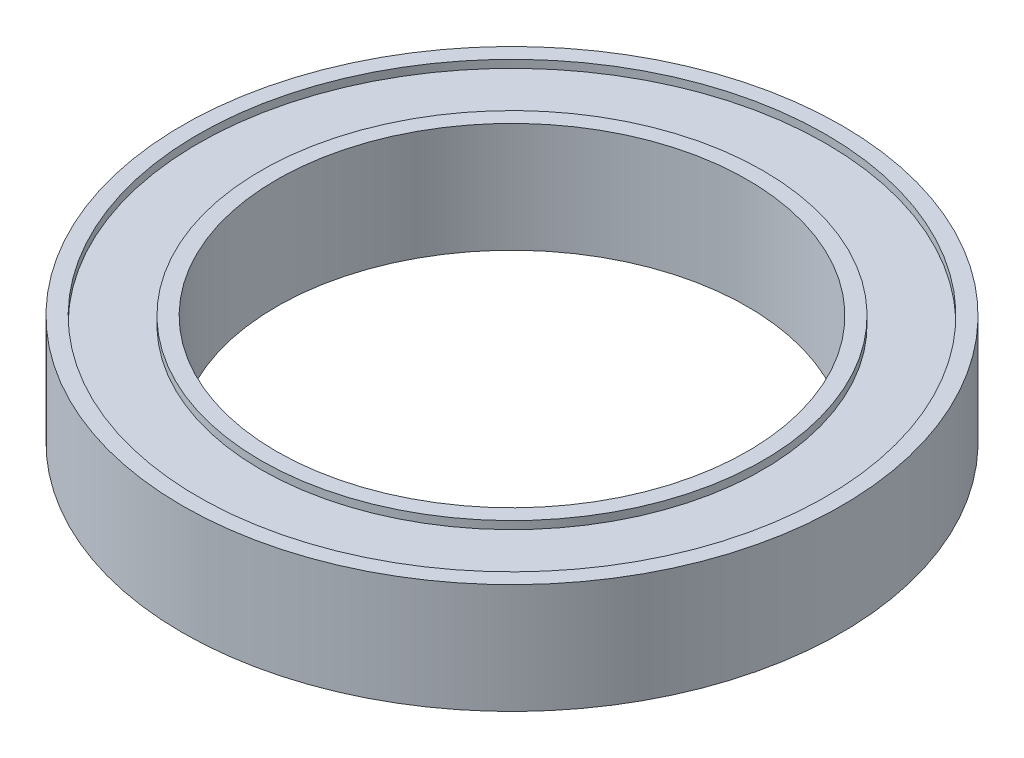
ISO-10303-21;
HEADER;
FILE_DESCRIPTION(('STEP AP214'),'2;1');
FILE_NAME('part.step','',(''),(''),'','','');
FILE_SCHEMA(('AUTOMOTIVE_DESIGN { 1 0 10303 214 1 1 1 1 }'));
ENDSEC;
DATA;
#1=APPLICATION_CONTEXT('core data for automotive mechanical design processes');
#2=APPLICATION_PROTOCOL_DEFINITION('international standard','automotive_design',2000,#1);
#3=PRODUCT_CONTEXT('',#1,'mechanical');
#4=PRODUCT('Part','Part','',(#3));
#5=PRODUCT_RELATED_PRODUCT_CATEGORY('part','',(#4));
#6=PRODUCT_DEFINITION_FORMATION('','',#4);
#7=PRODUCT_DEFINITION_CONTEXT('part definition',#1,'design');
#8=PRODUCT_DEFINITION('design','',#6,#7);
#9=PRODUCT_DEFINITION_SHAPE('','',#8);
#10=(LENGTH_UNIT() NAMED_UNIT(*) SI_UNIT(.MILLI.,.METRE.));
#11=(NAMED_UNIT(*) PLANE_ANGLE_UNIT() SI_UNIT($,.RADIAN.));
#12=(NAMED_UNIT(*) SI_UNIT($,.STERADIAN.) SOLID_ANGLE_UNIT());
#13=UNCERTAINTY_MEASURE_WITH_UNIT(LENGTH_MEASURE(1.E-05),#10,'distance_accuracy_value','');
#14=(GEOMETRIC_REPRESENTATION_CONTEXT(3) GLOBAL_UNCERTAINTY_ASSIGNED_CONTEXT((#13)) GLOBAL_UNIT_ASSIGNED_CONTEXT((#10,
#11,#12)) REPRESENTATION_CONTEXT('',''));
#15=CARTESIAN_POINT('',(0.,0.,0.));
#16=DIRECTION('',(0.,0.,1.));
#17=DIRECTION('',(1.,0.,0.));
#18=AXIS2_PLACEMENT_3D('',#15,#16,#17);
#19=CARTESIAN_POINT('',(0.,-3.5,0.));
#20=DIRECTION('',(0.,1.,0.));
#21=DIRECTION('',(0.,0.,1.));
#22=AXIS2_PLACEMENT_3D('',#19,#20,#21);
#23=PLANE('',#22);
#24=CARTESIAN_POINT('',(0.,-3.5,0.));
#25=DIRECTION('',(0.,1.,0.));
#26=DIRECTION('',(0.,0.,1.));
#27=AXIS2_PLACEMENT_3D('',#24,#25,#26);
#28=CIRCLE('',#27,15.);
#29=CARTESIAN_POINT('',(0.,-3.5,15.));
#30=VERTEX_POINT('',#29);
#31=EDGE_CURVE('E61',#30,#30,#28,.T.);
#32=ORIENTED_EDGE('',*,*,#31,.T.);
#33=EDGE_LOOP('',(#32));
#34=FACE_BOUND('',#33,.T.);
#35=CARTESIAN_POINT('',(0.,-3.5,0.));
#36=DIRECTION('',(0.,1.,0.));
#37=DIRECTION('',(0.,0.,1.));
#38=AXIS2_PLACEMENT_3D('',#35,#36,#37);
#39=CIRCLE('',#38,16.);
#40=CARTESIAN_POINT('',(0.,-3.5,16.));
#41=VERTEX_POINT('',#40);
#42=EDGE_CURVE('E70',#41,#41,#39,.T.);
#43=ORIENTED_EDGE('',*,*,#42,.F.);
#44=EDGE_LOOP('',(#43));
#45=FACE_BOUND('',#44,.T.);
#46=ADVANCED_FACE('F45',(#34,#45),#23,.F.);
#47=CARTESIAN_POINT('',(0.,3.5,0.));
#48=DIRECTION('',(0.,1.,0.));
#49=DIRECTION('',(0.,0.,1.));
#50=AXIS2_PLACEMENT_3D('',#47,#48,#49);
#51=PLANE('',#50);
#52=CARTESIAN_POINT('',(0.,3.5,0.));
#53=DIRECTION('',(0.,1.,0.));
#54=DIRECTION('',(0.,0.,1.));
#55=AXIS2_PLACEMENT_3D('',#52,#53,#54);
#56=CIRCLE('',#55,15.);
#57=CARTESIAN_POINT('',(0.,3.5,15.));
#58=VERTEX_POINT('',#57);
#59=EDGE_CURVE('E58',#58,#58,#56,.T.);
#60=ORIENTED_EDGE('',*,*,#59,.F.);
#61=EDGE_LOOP('',(#60));
#62=FACE_BOUND('',#61,.T.);
#63=CARTESIAN_POINT('',(0.,3.5,0.));
#64=DIRECTION('',(0.,1.,0.));
#65=DIRECTION('',(0.,0.,1.));
#66=AXIS2_PLACEMENT_3D('',#63,#64,#65);
#67=CIRCLE('',#66,16.);
#68=CARTESIAN_POINT('',(0.,3.5,-16.));
#69=VERTEX_POINT('',#68);
#70=EDGE_CURVE('E64',#69,#69,#67,.F.);
#71=ORIENTED_EDGE('',*,*,#70,.F.);
#72=EDGE_LOOP('',(#71));
#73=FACE_BOUND('',#72,.T.);
#74=ADVANCED_FACE('F112',(#62,#73),#51,.T.);
#75=CARTESIAN_POINT('',(0.,3.5,0.));
#76=DIRECTION('',(0.,1.,0.));
#77=DIRECTION('',(0.,0.,1.));
#78=AXIS2_PLACEMENT_3D('',#75,#76,#77);
#79=CIRCLE('',#78,20.);
#80=CARTESIAN_POINT('',(0.,3.5,-20.));
#81=VERTEX_POINT('',#80);
#82=EDGE_CURVE('E67',#81,#81,#79,.F.);
#83=ORIENTED_EDGE('',*,*,#82,.T.);
#84=EDGE_LOOP('',(#83));
#85=FACE_BOUND('',#84,.T.);
#86=CARTESIAN_POINT('',(0.,3.5,0.));
#87=DIRECTION('',(0.,1.,0.));
#88=DIRECTION('',(0.,0.,1.));
#89=AXIS2_PLACEMENT_3D('',#86,#87,#88);
#90=CIRCLE('',#89,21.);
#91=CARTESIAN_POINT('',(0.,3.5,21.));
#92=VERTEX_POINT('',#91);
#93=EDGE_CURVE('E10',#92,#92,#90,.T.);
#94=ORIENTED_EDGE('',*,*,#93,.T.);
#95=EDGE_LOOP('',(#94));
#96=FACE_BOUND('',#95,.T.);
#97=ADVANCED_FACE('F117',(#85,#96),#51,.T.);
#98=CARTESIAN_POINT('',(0.,-3.5,0.));
#99=DIRECTION('',(0.,1.,0.));
#100=DIRECTION('',(0.,0.,1.));
#101=AXIS2_PLACEMENT_3D('',#98,#99,#100);
#102=CIRCLE('',#101,20.);
#103=CARTESIAN_POINT('',(0.,-3.5,20.));
#104=VERTEX_POINT('',#103);
#105=EDGE_CURVE('E49',#104,#104,#102,.T.);
#106=ORIENTED_EDGE('',*,*,#105,.T.);
#107=EDGE_LOOP('',(#106));
#108=FACE_BOUND('',#107,.T.);
#109=CARTESIAN_POINT('',(0.,-3.5,0.));
#110=DIRECTION('',(0.,1.,0.));
#111=DIRECTION('',(0.,0.,1.));
#112=AXIS2_PLACEMENT_3D('',#109,#110,#111);
#113=CIRCLE('',#112,21.);
#114=CARTESIAN_POINT('',(0.,-3.5,21.));
#115=VERTEX_POINT('',#114);
#116=EDGE_CURVE('E53',#115,#115,#113,.T.);
#117=ORIENTED_EDGE('',*,*,#116,.F.);
#118=EDGE_LOOP('',(#117));
#119=FACE_BOUND('',#118,.T.);
#120=ADVANCED_FACE('F108',(#108,#119),#23,.F.);
#121=CARTESIAN_POINT('',(0.,3.5,0.));
#122=DIRECTION('',(0.,-1.,0.));
#123=DIRECTION('',(0.,0.,-1.));
#124=AXIS2_PLACEMENT_3D('',#121,#122,#123);
#125=CYLINDRICAL_SURFACE('',#124,21.);
#126=ORIENTED_EDGE('',*,*,#93,.F.);
#127=EDGE_LOOP('',(#126));
#128=FACE_BOUND('',#127,.T.);
#129=ORIENTED_EDGE('',*,*,#116,.T.);
#130=EDGE_LOOP('',(#129));
#131=FACE_BOUND('',#130,.T.);
#132=ADVANCED_FACE('F47',(#128,#131),#125,.T.);
#133=CARTESIAN_POINT('',(0.,3.5,0.));
#134=DIRECTION('',(0.,-1.,0.));
#135=DIRECTION('',(0.,0.,-1.));
#136=AXIS2_PLACEMENT_3D('',#133,#134,#135);
#137=CYLINDRICAL_SURFACE('',#136,15.);
#138=ORIENTED_EDGE('',*,*,#59,.T.);
#139=EDGE_LOOP('',(#138));
#140=FACE_BOUND('',#139,.T.);
#141=ORIENTED_EDGE('',*,*,#31,.F.);
#142=EDGE_LOOP('',(#141));
#143=FACE_BOUND('',#142,.T.);
#144=ADVANCED_FACE('F96',(#140,#143),#137,.F.);
#145=CARTESIAN_POINT('',(0.,3.500012,0.));
#146=DIRECTION('',(0.,-1.,0.));
#147=DIRECTION('',(0.,0.,-1.));
#148=AXIS2_PLACEMENT_3D('',#145,#146,#147);
#149=CYLINDRICAL_SURFACE('',#148,20.);
#150=CARTESIAN_POINT('',(0.,3.,0.));
#151=DIRECTION('',(0.,1.,0.));
#152=DIRECTION('',(0.,0.,1.));
#153=AXIS2_PLACEMENT_3D('',#150,#151,#152);
#154=CIRCLE('',#153,20.);
#155=CARTESIAN_POINT('',(0.,3.,-20.));
#156=VERTEX_POINT('',#155);
#157=EDGE_CURVE('E68',#156,#156,#154,.T.);
#158=CARTESIAN_POINT('',(0.,3.5,-20.));
#159=CARTESIAN_POINT('',(0.,3.49479166666667,-20.));
#160=CARTESIAN_POINT('',(0.,3.48958333333333,-20.));
#161=CARTESIAN_POINT('',(0.,3.47916666666667,-20.));
#162=CARTESIAN_POINT('',(0.,3.47395833333333,-20.));
#163=CARTESIAN_POINT('',(0.,3.46354166666667,-20.));
#164=CARTESIAN_POINT('',(0.,3.45833333333333,-20.));
#165=CARTESIAN_POINT('',(0.,3.44791666666667,-20.));
#166=CARTESIAN_POINT('',(0.,3.44270833333333,-20.));
#167=CARTESIAN_POINT('',(0.,3.43229166666667,-20.));
#168=CARTESIAN_POINT('',(0.,3.42708333333333,-20.));
#169=CARTESIAN_POINT('',(0.,3.41666666666667,-20.));
#170=CARTESIAN_POINT('',(0.,3.41145833333333,-20.));
#171=CARTESIAN_POINT('',(0.,3.40104166666667,-20.));
#172=CARTESIAN_POINT('',(0.,3.39583333333333,-20.));
#173=CARTESIAN_POINT('',(0.,3.38541666666667,-20.));
#174=CARTESIAN_POINT('',(0.,3.38020833333333,-20.));
#175=CARTESIAN_POINT('',(0.,3.36979166666667,-20.));
#176=CARTESIAN_POINT('',(0.,3.36458333333333,-20.));
#177=CARTESIAN_POINT('',(0.,3.35416666666667,-20.));
#178=CARTESIAN_POINT('',(0.,3.34895833333333,-20.));
#179=CARTESIAN_POINT('',(0.,3.33854166666667,-20.));
#180=CARTESIAN_POINT('',(0.,3.33333333333333,-20.));
#181=CARTESIAN_POINT('',(0.,3.32291666666667,-20.));
#182=CARTESIAN_POINT('',(0.,3.31770833333333,-20.));
#183=CARTESIAN_POINT('',(0.,3.30729166666667,-20.));
#184=CARTESIAN_POINT('',(0.,3.30208333333333,-20.));
#185=CARTESIAN_POINT('',(0.,3.29166666666667,-20.));
#186=CARTESIAN_POINT('',(0.,3.28645833333333,-20.));
#187=CARTESIAN_POINT('',(0.,3.27604166666667,-20.));
#188=CARTESIAN_POINT('',(0.,3.27083333333333,-20.));
#189=CARTESIAN_POINT('',(0.,3.26041666666667,-20.));
#190=CARTESIAN_POINT('',(0.,3.25520833333333,-20.));
#191=CARTESIAN_POINT('',(0.,3.24479166666667,-20.));
#192=CARTESIAN_POINT('',(0.,3.23958333333333,-20.));
#193=CARTESIAN_POINT('',(0.,3.22916666666667,-20.));
#194=CARTESIAN_POINT('',(0.,3.22395833333333,-20.));
#195=CARTESIAN_POINT('',(0.,3.21354166666667,-20.));
#196=CARTESIAN_POINT('',(0.,3.20833333333333,-20.));
#197=CARTESIAN_POINT('',(0.,3.19791666666667,-20.));
#198=CARTESIAN_POINT('',(0.,3.19270833333333,-20.));
#199=CARTESIAN_POINT('',(0.,3.18229166666667,-20.));
#200=CARTESIAN_POINT('',(0.,3.17708333333333,-20.));
#201=CARTESIAN_POINT('',(0.,3.16666666666667,-20.));
#202=CARTESIAN_POINT('',(0.,3.16145833333333,-20.));
#203=CARTESIAN_POINT('',(0.,3.15104166666667,-20.));
#204=CARTESIAN_POINT('',(0.,3.14583333333333,-20.));
#205=CARTESIAN_POINT('',(0.,3.13541666666667,-20.));
#206=CARTESIAN_POINT('',(0.,3.13020833333333,-20.));
#207=CARTESIAN_POINT('',(0.,3.11979166666667,-20.));
#208=CARTESIAN_POINT('',(0.,3.11458333333333,-20.));
#209=CARTESIAN_POINT('',(0.,3.10416666666667,-20.));
#210=CARTESIAN_POINT('',(0.,3.09895833333333,-20.));
#211=CARTESIAN_POINT('',(0.,3.08854166666667,-20.));
#212=CARTESIAN_POINT('',(0.,3.08333333333333,-20.));
#213=CARTESIAN_POINT('',(0.,3.07291666666667,-20.));
#214=CARTESIAN_POINT('',(0.,3.06770833333333,-20.));
#215=CARTESIAN_POINT('',(0.,3.05729166666667,-20.));
#216=CARTESIAN_POINT('',(0.,3.05208333333333,-20.));
#217=CARTESIAN_POINT('',(0.,3.04166666666667,-20.));
#218=CARTESIAN_POINT('',(0.,3.03645833333333,-20.));
#219=CARTESIAN_POINT('',(0.,3.02604166666667,-20.));
#220=CARTESIAN_POINT('',(0.,3.02083333333333,-20.));
#221=CARTESIAN_POINT('',(0.,3.01041666666667,-20.));
#222=CARTESIAN_POINT('',(0.,3.00520833333333,-20.));
#223=CARTESIAN_POINT('',(0.,3.,-20.));
#224=B_SPLINE_CURVE_WITH_KNOTS('',3,(#158,#159,#160,#161,#162,#163,#164,#165,#166,#167,#168,
#169,#170,#171,#172,#173,#174,#175,#176,#177,#178,#179,#180,#181,#182,#183,#184,#185,#186,#187,
#188,#189,#190,#191,#192,#193,#194,#195,#196,#197,#198,#199,#200,#201,#202,#203,#204,#205,#206,
#207,#208,#209,#210,#211,#212,#213,#214,#215,#216,#217,#218,#219,#220,#221,#222,#223),
.UNSPECIFIED.,.F.,.F.,(4,2,2,2,2,2,2,2,2,2,2,2,2,2,2,2,2,2,2,2,2,2,2,2,2,2,2,2,2,2,2,2,4),(0.,
0.015625,0.03125,0.046875,0.0625000000000001,0.0781250000000001,0.0937500000000001,0.109375,
0.125,0.140625,0.15625,0.171875,0.1875,0.203125,0.21875,0.234375,0.25,0.265625,0.28125,0.296875,
0.3125,0.328125,0.34375,0.359375,0.375,0.390625,0.40625,0.421875,0.4375,0.453125,0.46875,
0.484375,0.5),.UNSPECIFIED.);
#225=EDGE_CURVE('BSEAM98',#81,#156,#224,.T.);
#226=ORIENTED_EDGE('',*,*,#82,.F.);
#227=ORIENTED_EDGE('',*,*,#157,.F.);
#228=ORIENTED_EDGE('',*,*,#225,.T.);
#229=ORIENTED_EDGE('',*,*,#225,.F.);
#230=EDGE_LOOP('',(#226,#228,#227,#229));
#231=FACE_BOUND('',#230,.T.);
#232=ADVANCED_FACE('F98',(#231),#149,.F.);
#233=CARTESIAN_POINT('',(0.,3.500012,0.));
#234=DIRECTION('',(0.,-1.,0.));
#235=DIRECTION('',(0.,0.,-1.));
#236=AXIS2_PLACEMENT_3D('',#233,#234,#235);
#237=CYLINDRICAL_SURFACE('',#236,16.);
#238=CARTESIAN_POINT('',(0.,3.,0.));
#239=DIRECTION('',(0.,1.,0.));
#240=DIRECTION('',(0.,0.,1.));
#241=AXIS2_PLACEMENT_3D('',#238,#239,#240);
#242=CIRCLE('',#241,16.);
#243=CARTESIAN_POINT('',(0.,3.,-16.));
#244=VERTEX_POINT('',#243);
#245=EDGE_CURVE('E76',#244,#244,#242,.T.);
#246=CARTESIAN_POINT('',(0.,3.5,-16.));
#247=CARTESIAN_POINT('',(0.,3.49479166666667,-16.));
#248=CARTESIAN_POINT('',(0.,3.48958333333333,-16.));
#249=CARTESIAN_POINT('',(0.,3.47916666666667,-16.));
#250=CARTESIAN_POINT('',(0.,3.47395833333333,-16.));
#251=CARTESIAN_POINT('',(0.,3.46354166666667,-16.));
#252=CARTESIAN_POINT('',(0.,3.45833333333333,-16.));
#253=CARTESIAN_POINT('',(0.,3.44791666666667,-16.));
#254=CARTESIAN_POINT('',(0.,3.44270833333333,-16.));
#255=CARTESIAN_POINT('',(0.,3.43229166666667,-16.));
#256=CARTESIAN_POINT('',(0.,3.42708333333333,-16.));
#257=CARTESIAN_POINT('',(0.,3.41666666666667,-16.));
#258=CARTESIAN_POINT('',(0.,3.41145833333333,-16.));
#259=CARTESIAN_POINT('',(0.,3.40104166666667,-16.));
#260=CARTESIAN_POINT('',(0.,3.39583333333333,-16.));
#261=CARTESIAN_POINT('',(0.,3.38541666666667,-16.));
#262=CARTESIAN_POINT('',(0.,3.38020833333333,-16.));
#263=CARTESIAN_POINT('',(0.,3.36979166666667,-16.));
#264=CARTESIAN_POINT('',(0.,3.36458333333333,-16.));
#265=CARTESIAN_POINT('',(0.,3.35416666666667,-16.));
#266=CARTESIAN_POINT('',(0.,3.34895833333333,-16.));
#267=CARTESIAN_POINT('',(0.,3.33854166666667,-16.));
#268=CARTESIAN_POINT('',(0.,3.33333333333333,-16.));
#269=CARTESIAN_POINT('',(0.,3.32291666666667,-16.));
#270=CARTESIAN_POINT('',(0.,3.31770833333333,-16.));
#271=CARTESIAN_POINT('',(0.,3.30729166666667,-16.));
#272=CARTESIAN_POINT('',(0.,3.30208333333333,-16.));
#273=CARTESIAN_POINT('',(0.,3.29166666666667,-16.));
#274=CARTESIAN_POINT('',(0.,3.28645833333333,-16.));
#275=CARTESIAN_POINT('',(0.,3.27604166666667,-16.));
#276=CARTESIAN_POINT('',(0.,3.27083333333333,-16.));
#277=CARTESIAN_POINT('',(0.,3.26041666666667,-16.));
#278=CARTESIAN_POINT('',(0.,3.25520833333333,-16.));
#279=CARTESIAN_POINT('',(0.,3.24479166666667,-16.));
#280=CARTESIAN_POINT('',(0.,3.23958333333333,-16.));
#281=CARTESIAN_POINT('',(0.,3.22916666666667,-16.));
#282=CARTESIAN_POINT('',(0.,3.22395833333333,-16.));
#283=CARTESIAN_POINT('',(0.,3.21354166666667,-16.));
#284=CARTESIAN_POINT('',(0.,3.20833333333333,-16.));
#285=CARTESIAN_POINT('',(0.,3.19791666666667,-16.));
#286=CARTESIAN_POINT('',(0.,3.19270833333333,-16.));
#287=CARTESIAN_POINT('',(0.,3.18229166666667,-16.));
#288=CARTESIAN_POINT('',(0.,3.17708333333333,-16.));
#289=CARTESIAN_POINT('',(0.,3.16666666666667,-16.));
#290=CARTESIAN_POINT('',(0.,3.16145833333333,-16.));
#291=CARTESIAN_POINT('',(0.,3.15104166666667,-16.));
#292=CARTESIAN_POINT('',(0.,3.14583333333333,-16.));
#293=CARTESIAN_POINT('',(0.,3.13541666666667,-16.));
#294=CARTESIAN_POINT('',(0.,3.13020833333333,-16.));
#295=CARTESIAN_POINT('',(0.,3.11979166666667,-16.));
#296=CARTESIAN_POINT('',(0.,3.11458333333333,-16.));
#297=CARTESIAN_POINT('',(0.,3.10416666666667,-16.));
#298=CARTESIAN_POINT('',(0.,3.09895833333333,-16.));
#299=CARTESIAN_POINT('',(0.,3.08854166666667,-16.));
#300=CARTESIAN_POINT('',(0.,3.08333333333333,-16.));
#301=CARTESIAN_POINT('',(0.,3.07291666666667,-16.));
#302=CARTESIAN_POINT('',(0.,3.06770833333333,-16.));
#303=CARTESIAN_POINT('',(0.,3.05729166666667,-16.));
#304=CARTESIAN_POINT('',(0.,3.05208333333333,-16.));
#305=CARTESIAN_POINT('',(0.,3.04166666666667,-16.));
#306=CARTESIAN_POINT('',(0.,3.03645833333333,-16.));
#307=CARTESIAN_POINT('',(0.,3.02604166666667,-16.));
#308=CARTESIAN_POINT('',(0.,3.02083333333333,-16.));
#309=CARTESIAN_POINT('',(0.,3.01041666666667,-16.));
#310=CARTESIAN_POINT('',(0.,3.00520833333333,-16.));
#311=CARTESIAN_POINT('',(0.,3.,-16.));
#312=B_SPLINE_CURVE_WITH_KNOTS('',3,(#246,#247,#248,#249,#250,#251,#252,#253,#254,#255,#256,
#257,#258,#259,#260,#261,#262,#263,#264,#265,#266,#267,#268,#269,#270,#271,#272,#273,#274,#275,
#276,#277,#278,#279,#280,#281,#282,#283,#284,#285,#286,#287,#288,#289,#290,#291,#292,#293,#294,
#295,#296,#297,#298,#299,#300,#301,#302,#303,#304,#305,#306,#307,#308,#309,#310,#311),
.UNSPECIFIED.,.F.,.F.,(4,2,2,2,2,2,2,2,2,2,2,2,2,2,2,2,2,2,2,2,2,2,2,2,2,2,2,2,2,2,2,2,4),(0.,
0.015625,0.03125,0.046875,0.0625000000000001,0.0781250000000001,0.0937500000000001,0.109375,
0.125,0.140625,0.15625,0.171875,0.1875,0.203125,0.21875,0.234375,0.25,0.265625,0.28125,0.296875,
0.3125,0.328125,0.34375,0.359375,0.375,0.390625,0.40625,0.421875,0.4375,0.453125,0.46875,
0.484375,0.5),.UNSPECIFIED.);
#313=EDGE_CURVE('BSEAM105',#69,#244,#312,.T.);
#314=ORIENTED_EDGE('',*,*,#70,.T.);
#315=ORIENTED_EDGE('',*,*,#245,.T.);
#316=ORIENTED_EDGE('',*,*,#313,.T.);
#317=ORIENTED_EDGE('',*,*,#313,.F.);
#318=EDGE_LOOP('',(#314,#316,#315,#317));
#319=FACE_BOUND('',#318,.T.);
#320=ADVANCED_FACE('F105',(#319),#237,.T.);
#321=CARTESIAN_POINT('',(0.,3.,0.));
#322=DIRECTION('',(0.,1.,0.));
#323=DIRECTION('',(0.,0.,1.));
#324=AXIS2_PLACEMENT_3D('',#321,#322,#323);
#325=PLANE('',#324);
#326=ORIENTED_EDGE('',*,*,#245,.F.);
#327=EDGE_LOOP('',(#326));
#328=FACE_BOUND('',#327,.T.);
#329=ORIENTED_EDGE('',*,*,#157,.T.);
#330=EDGE_LOOP('',(#329));
#331=FACE_BOUND('',#330,.T.);
#332=ADVANCED_FACE('F132',(#328,#331),#325,.T.);
#333=CARTESIAN_POINT('',(0.,-3.500012,0.));
#334=DIRECTION('',(0.,1.,0.));
#335=DIRECTION('',(0.,0.,1.));
#336=AXIS2_PLACEMENT_3D('',#333,#334,#335);
#337=CYLINDRICAL_SURFACE('',#336,20.);
#338=CARTESIAN_POINT('',(0.,-3.,0.));
#339=DIRECTION('',(0.,1.,0.));
#340=DIRECTION('',(0.,0.,1.));
#341=AXIS2_PLACEMENT_3D('',#338,#339,#340);
#342=CIRCLE('',#341,20.);
#343=CARTESIAN_POINT('',(0.,-3.,20.));
#344=VERTEX_POINT('',#343);
#345=EDGE_CURVE('E72',#344,#344,#342,.T.);
#346=CARTESIAN_POINT('',(0.,-3.,20.));
#347=CARTESIAN_POINT('',(0.,-3.00520833333333,20.));
#348=CARTESIAN_POINT('',(0.,-3.01041666666667,20.));
#349=CARTESIAN_POINT('',(0.,-3.02083333333333,20.));
#350=CARTESIAN_POINT('',(0.,-3.02604166666667,20.));
#351=CARTESIAN_POINT('',(0.,-3.03645833333333,20.));
#352=CARTESIAN_POINT('',(0.,-3.04166666666667,20.));
#353=CARTESIAN_POINT('',(0.,-3.05208333333333,20.));
#354=CARTESIAN_POINT('',(0.,-3.05729166666667,20.));
#355=CARTESIAN_POINT('',(0.,-3.06770833333333,20.));
#356=CARTESIAN_POINT('',(0.,-3.07291666666667,20.));
#357=CARTESIAN_POINT('',(0.,-3.08333333333333,20.));
#358=CARTESIAN_POINT('',(0.,-3.08854166666667,20.));
#359=CARTESIAN_POINT('',(0.,-3.09895833333333,20.));
#360=CARTESIAN_POINT('',(0.,-3.10416666666667,20.));
#361=CARTESIAN_POINT('',(0.,-3.11458333333333,20.));
#362=CARTESIAN_POINT('',(0.,-3.11979166666667,20.));
#363=CARTESIAN_POINT('',(0.,-3.13020833333333,20.));
#364=CARTESIAN_POINT('',(0.,-3.13541666666667,20.));
#365=CARTESIAN_POINT('',(0.,-3.14583333333333,20.));
#366=CARTESIAN_POINT('',(0.,-3.15104166666667,20.));
#367=CARTESIAN_POINT('',(0.,-3.16145833333333,20.));
#368=CARTESIAN_POINT('',(0.,-3.16666666666667,20.));
#369=CARTESIAN_POINT('',(0.,-3.17708333333333,20.));
#370=CARTESIAN_POINT('',(0.,-3.18229166666667,20.));
#371=CARTESIAN_POINT('',(0.,-3.19270833333333,20.));
#372=CARTESIAN_POINT('',(0.,-3.19791666666667,20.));
#373=CARTESIAN_POINT('',(0.,-3.20833333333333,20.));
#374=CARTESIAN_POINT('',(0.,-3.21354166666667,20.));
#375=CARTESIAN_POINT('',(0.,-3.22395833333333,20.));
#376=CARTESIAN_POINT('',(0.,-3.22916666666667,20.));
#377=CARTESIAN_POINT('',(0.,-3.23958333333333,20.));
#378=CARTESIAN_POINT('',(0.,-3.24479166666667,20.));
#379=CARTESIAN_POINT('',(0.,-3.25520833333333,20.));
#380=CARTESIAN_POINT('',(0.,-3.26041666666667,20.));
#381=CARTESIAN_POINT('',(0.,-3.27083333333333,20.));
#382=CARTESIAN_POINT('',(0.,-3.27604166666667,20.));
#383=CARTESIAN_POINT('',(0.,-3.28645833333333,20.));
#384=CARTESIAN_POINT('',(0.,-3.29166666666667,20.));
#385=CARTESIAN_POINT('',(0.,-3.30208333333333,20.));
#386=CARTESIAN_POINT('',(0.,-3.30729166666667,20.));
#387=CARTESIAN_POINT('',(0.,-3.31770833333333,20.));
#388=CARTESIAN_POINT('',(0.,-3.32291666666667,20.));
#389=CARTESIAN_POINT('',(0.,-3.33333333333333,20.));
#390=CARTESIAN_POINT('',(0.,-3.33854166666667,20.));
#391=CARTESIAN_POINT('',(0.,-3.34895833333333,20.));
#392=CARTESIAN_POINT('',(0.,-3.35416666666667,20.));
#393=CARTESIAN_POINT('',(0.,-3.36458333333333,20.));
#394=CARTESIAN_POINT('',(0.,-3.36979166666667,20.));
#395=CARTESIAN_POINT('',(0.,-3.38020833333333,20.));
#396=CARTESIAN_POINT('',(0.,-3.38541666666667,20.));
#397=CARTESIAN_POINT('',(0.,-3.39583333333333,20.));
#398=CARTESIAN_POINT('',(0.,-3.40104166666667,20.));
#399=CARTESIAN_POINT('',(0.,-3.41145833333333,20.));
#400=CARTESIAN_POINT('',(0.,-3.41666666666667,20.));
#401=CARTESIAN_POINT('',(0.,-3.42708333333333,20.));
#402=CARTESIAN_POINT('',(0.,-3.43229166666667,20.));
#403=CARTESIAN_POINT('',(0.,-3.44270833333333,20.));
#404=CARTESIAN_POINT('',(0.,-3.44791666666667,20.));
#405=CARTESIAN_POINT('',(0.,-3.45833333333333,20.));
#406=CARTESIAN_POINT('',(0.,-3.46354166666667,20.));
#407=CARTESIAN_POINT('',(0.,-3.47395833333333,20.));
#408=CARTESIAN_POINT('',(0.,-3.47916666666667,20.));
#409=CARTESIAN_POINT('',(0.,-3.48958333333333,20.));
#410=CARTESIAN_POINT('',(0.,-3.49479166666667,20.));
#411=CARTESIAN_POINT('',(0.,-3.5,20.));
#412=B_SPLINE_CURVE_WITH_KNOTS('',3,(#346,#347,#348,#349,#350,#351,#352,#353,#354,#355,#356,
#357,#358,#359,#360,#361,#362,#363,#364,#365,#366,#367,#368,#369,#370,#371,#372,#373,#374,#375,
#376,#377,#378,#379,#380,#381,#382,#383,#384,#385,#386,#387,#388,#389,#390,#391,#392,#393,#394,
#395,#396,#397,#398,#399,#400,#401,#402,#403,#404,#405,#406,#407,#408,#409,#410,#411),
.UNSPECIFIED.,.F.,.F.,(4,2,2,2,2,2,2,2,2,2,2,2,2,2,2,2,2,2,2,2,2,2,2,2,2,2,2,2,2,2,2,2,4),(0.,
0.015625,0.03125,0.0468749999999996,0.0624999999999996,0.0781249999999996,0.0937499999999997,
0.109375,0.125,0.140625,0.15625,0.171875,0.1875,0.203125,0.21875,0.234375,0.25,0.265625,0.28125,
0.296875,0.3125,0.328125,0.34375,0.359375,0.375,0.390625,0.40625,0.421875,0.4375,0.453125,
0.46875,0.484375,0.5),.UNSPECIFIED.);
#413=EDGE_CURVE('BSEAM130',#344,#104,#412,.T.);
#414=ORIENTED_EDGE('',*,*,#345,.T.);
#415=ORIENTED_EDGE('',*,*,#105,.F.);
#416=ORIENTED_EDGE('',*,*,#413,.T.);
#417=ORIENTED_EDGE('',*,*,#413,.F.);
#418=EDGE_LOOP('',(#414,#416,#415,#417));
#419=FACE_BOUND('',#418,.T.);
#420=ADVANCED_FACE('F130',(#419),#337,.F.);
#421=CARTESIAN_POINT('',(0.,-3.500012,0.));
#422=DIRECTION('',(0.,1.,0.));
#423=DIRECTION('',(0.,0.,1.));
#424=AXIS2_PLACEMENT_3D('',#421,#422,#423);
#425=CYLINDRICAL_SURFACE('',#424,16.);
#426=CARTESIAN_POINT('',(0.,-3.,0.));
#427=DIRECTION('',(0.,1.,0.));
#428=DIRECTION('',(0.,0.,1.));
#429=AXIS2_PLACEMENT_3D('',#426,#427,#428);
#430=CIRCLE('',#429,16.);
#431=CARTESIAN_POINT('',(0.,-3.,16.));
#432=VERTEX_POINT('',#431);
#433=EDGE_CURVE('E78',#432,#432,#430,.T.);
#434=CARTESIAN_POINT('',(0.,-3.,16.));
#435=CARTESIAN_POINT('',(0.,-3.00520833333333,16.));
#436=CARTESIAN_POINT('',(0.,-3.01041666666667,16.));
#437=CARTESIAN_POINT('',(0.,-3.02083333333333,16.));
#438=CARTESIAN_POINT('',(0.,-3.02604166666667,16.));
#439=CARTESIAN_POINT('',(0.,-3.03645833333333,16.));
#440=CARTESIAN_POINT('',(0.,-3.04166666666667,16.));
#441=CARTESIAN_POINT('',(0.,-3.05208333333333,16.));
#442=CARTESIAN_POINT('',(0.,-3.05729166666667,16.));
#443=CARTESIAN_POINT('',(0.,-3.06770833333333,16.));
#444=CARTESIAN_POINT('',(0.,-3.07291666666667,16.));
#445=CARTESIAN_POINT('',(0.,-3.08333333333333,16.));
#446=CARTESIAN_POINT('',(0.,-3.08854166666667,16.));
#447=CARTESIAN_POINT('',(0.,-3.09895833333333,16.));
#448=CARTESIAN_POINT('',(0.,-3.10416666666667,16.));
#449=CARTESIAN_POINT('',(0.,-3.11458333333333,16.));
#450=CARTESIAN_POINT('',(0.,-3.11979166666667,16.));
#451=CARTESIAN_POINT('',(0.,-3.13020833333333,16.));
#452=CARTESIAN_POINT('',(0.,-3.13541666666667,16.));
#453=CARTESIAN_POINT('',(0.,-3.14583333333333,16.));
#454=CARTESIAN_POINT('',(0.,-3.15104166666667,16.));
#455=CARTESIAN_POINT('',(0.,-3.16145833333333,16.));
#456=CARTESIAN_POINT('',(0.,-3.16666666666667,16.));
#457=CARTESIAN_POINT('',(0.,-3.17708333333333,16.));
#458=CARTESIAN_POINT('',(0.,-3.18229166666667,16.));
#459=CARTESIAN_POINT('',(0.,-3.19270833333333,16.));
#460=CARTESIAN_POINT('',(0.,-3.19791666666667,16.));
#461=CARTESIAN_POINT('',(0.,-3.20833333333333,16.));
#462=CARTESIAN_POINT('',(0.,-3.21354166666667,16.));
#463=CARTESIAN_POINT('',(0.,-3.22395833333333,16.));
#464=CARTESIAN_POINT('',(0.,-3.22916666666667,16.));
#465=CARTESIAN_POINT('',(0.,-3.23958333333333,16.));
#466=CARTESIAN_POINT('',(0.,-3.24479166666667,16.));
#467=CARTESIAN_POINT('',(0.,-3.25520833333333,16.));
#468=CARTESIAN_POINT('',(0.,-3.26041666666667,16.));
#469=CARTESIAN_POINT('',(0.,-3.27083333333333,16.));
#470=CARTESIAN_POINT('',(0.,-3.27604166666667,16.));
#471=CARTESIAN_POINT('',(0.,-3.28645833333333,16.));
#472=CARTESIAN_POINT('',(0.,-3.29166666666667,16.));
#473=CARTESIAN_POINT('',(0.,-3.30208333333333,16.));
#474=CARTESIAN_POINT('',(0.,-3.30729166666667,16.));
#475=CARTESIAN_POINT('',(0.,-3.31770833333333,16.));
#476=CARTESIAN_POINT('',(0.,-3.32291666666667,16.));
#477=CARTESIAN_POINT('',(0.,-3.33333333333333,16.));
#478=CARTESIAN_POINT('',(0.,-3.33854166666667,16.));
#479=CARTESIAN_POINT('',(0.,-3.34895833333333,16.));
#480=CARTESIAN_POINT('',(0.,-3.35416666666667,16.));
#481=CARTESIAN_POINT('',(0.,-3.36458333333333,16.));
#482=CARTESIAN_POINT('',(0.,-3.36979166666667,16.));
#483=CARTESIAN_POINT('',(0.,-3.38020833333333,16.));
#484=CARTESIAN_POINT('',(0.,-3.38541666666667,16.));
#485=CARTESIAN_POINT('',(0.,-3.39583333333333,16.));
#486=CARTESIAN_POINT('',(0.,-3.40104166666667,16.));
#487=CARTESIAN_POINT('',(0.,-3.41145833333333,16.));
#488=CARTESIAN_POINT('',(0.,-3.41666666666667,16.));
#489=CARTESIAN_POINT('',(0.,-3.42708333333333,16.));
#490=CARTESIAN_POINT('',(0.,-3.43229166666667,16.));
#491=CARTESIAN_POINT('',(0.,-3.44270833333333,16.));
#492=CARTESIAN_POINT('',(0.,-3.44791666666667,16.));
#493=CARTESIAN_POINT('',(0.,-3.45833333333333,16.));
#494=CARTESIAN_POINT('',(0.,-3.46354166666667,16.));
#495=CARTESIAN_POINT('',(0.,-3.47395833333333,16.));
#496=CARTESIAN_POINT('',(0.,-3.47916666666667,16.));
#497=CARTESIAN_POINT('',(0.,-3.48958333333333,16.));
#498=CARTESIAN_POINT('',(0.,-3.49479166666667,16.));
#499=CARTESIAN_POINT('',(0.,-3.5,16.));
#500=B_SPLINE_CURVE_WITH_KNOTS('',3,(#434,#435,#436,#437,#438,#439,#440,#441,#442,#443,#444,
#445,#446,#447,#448,#449,#450,#451,#452,#453,#454,#455,#456,#457,#458,#459,#460,#461,#462,#463,
#464,#465,#466,#467,#468,#469,#470,#471,#472,#473,#474,#475,#476,#477,#478,#479,#480,#481,#482,
#483,#484,#485,#486,#487,#488,#489,#490,#491,#492,#493,#494,#495,#496,#497,#498,#499),
.UNSPECIFIED.,.F.,.F.,(4,2,2,2,2,2,2,2,2,2,2,2,2,2,2,2,2,2,2,2,2,2,2,2,2,2,2,2,2,2,2,2,4),(0.,
0.015625,0.03125,0.0468749999999996,0.0624999999999996,0.0781249999999996,0.0937499999999997,
0.109375,0.125,0.140625,0.15625,0.171875,0.1875,0.203125,0.21875,0.234375,0.25,0.265625,0.28125,
0.296875,0.3125,0.328125,0.34375,0.359375,0.375,0.390625,0.40625,0.421875,0.4375,0.453125,
0.46875,0.484375,0.5),.UNSPECIFIED.);
#501=EDGE_CURVE('BSEAM131',#432,#41,#500,.T.);
#502=ORIENTED_EDGE('',*,*,#433,.F.);
#503=ORIENTED_EDGE('',*,*,#42,.T.);
#504=ORIENTED_EDGE('',*,*,#501,.T.);
#505=ORIENTED_EDGE('',*,*,#501,.F.);
#506=EDGE_LOOP('',(#502,#504,#503,#505));
#507=FACE_BOUND('',#506,.T.);
#508=ADVANCED_FACE('F131',(#507),#425,.T.);
#509=CARTESIAN_POINT('',(0.,-3.,0.));
#510=DIRECTION('',(0.,-1.,0.));
#511=DIRECTION('',(0.,0.,1.));
#512=AXIS2_PLACEMENT_3D('',#509,#510,#511);
#513=PLANE('',#512);
#514=ORIENTED_EDGE('',*,*,#345,.F.);
#515=EDGE_LOOP('',(#514));
#516=FACE_BOUND('',#515,.T.);
#517=ORIENTED_EDGE('',*,*,#433,.T.);
#518=EDGE_LOOP('',(#517));
#519=FACE_BOUND('',#518,.T.);
#520=ADVANCED_FACE('F137',(#516,#519),#513,.T.);
#521=CLOSED_SHELL('',(#46,#74,#97,#120,#132,#144,#232,#320,#332,#420,#508,#520));
#522=MANIFOLD_SOLID_BREP('B2',#521);
#523=ADVANCED_BREP_SHAPE_REPRESENTATION('',(#18,#522),#14);
#524=SHAPE_DEFINITION_REPRESENTATION(#9,#523);
ENDSEC;
END-ISO-10303-21;
